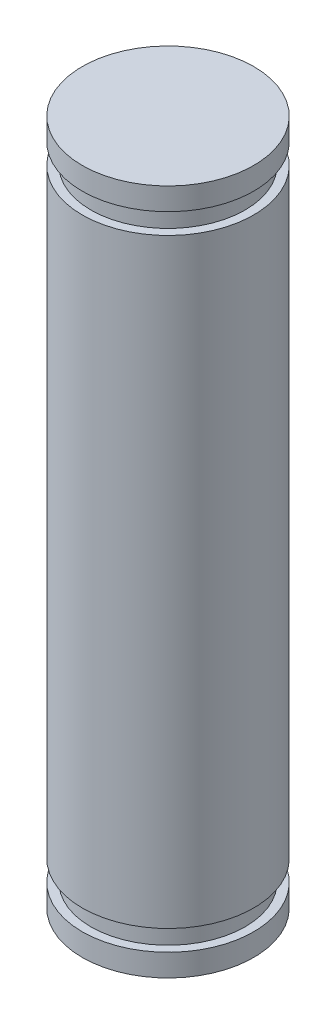
ISO-10303-21;
HEADER;
FILE_DESCRIPTION(('STEP AP214'),'2;1');
FILE_NAME('part.step','',(''),(''),'','','');
FILE_SCHEMA(('AUTOMOTIVE_DESIGN { 1 0 10303 214 1 1 1 1 }'));
ENDSEC;
DATA;
#1=APPLICATION_CONTEXT('core data for automotive mechanical design processes');
#2=APPLICATION_PROTOCOL_DEFINITION('international standard','automotive_design',2000,#1);
#3=PRODUCT_CONTEXT('',#1,'mechanical');
#4=PRODUCT('Part','Part','',(#3));
#5=PRODUCT_RELATED_PRODUCT_CATEGORY('part','',(#4));
#6=PRODUCT_DEFINITION_FORMATION('','',#4);
#7=PRODUCT_DEFINITION_CONTEXT('part definition',#1,'design');
#8=PRODUCT_DEFINITION('design','',#6,#7);
#9=PRODUCT_DEFINITION_SHAPE('','',#8);
#10=(LENGTH_UNIT() NAMED_UNIT(*) SI_UNIT(.MILLI.,.METRE.));
#11=(NAMED_UNIT(*) PLANE_ANGLE_UNIT() SI_UNIT($,.RADIAN.));
#12=(NAMED_UNIT(*) SI_UNIT($,.STERADIAN.) SOLID_ANGLE_UNIT());
#13=UNCERTAINTY_MEASURE_WITH_UNIT(LENGTH_MEASURE(1.E-05),#10,'distance_accuracy_value','');
#14=(GEOMETRIC_REPRESENTATION_CONTEXT(3) GLOBAL_UNCERTAINTY_ASSIGNED_CONTEXT((#13)) GLOBAL_UNIT_ASSIGNED_CONTEXT((#10,
#11,#12)) REPRESENTATION_CONTEXT('',''));
#15=CARTESIAN_POINT('',(0.,0.,0.));
#16=DIRECTION('',(0.,0.,1.));
#17=DIRECTION('',(1.,0.,0.));
#18=AXIS2_PLACEMENT_3D('',#15,#16,#17);
#19=CARTESIAN_POINT('',(-11.955644483101,36.1149363933196,0.));
#20=DIRECTION('',(0.,-1.,0.));
#21=DIRECTION('',(0.,0.,-1.));
#22=AXIS2_PLACEMENT_3D('',#19,#20,#21);
#23=CYLINDRICAL_SURFACE('',#22,5.);
#24=CARTESIAN_POINT('',(-11.955644483101,37.4149363933196,0.));
#25=DIRECTION('',(0.,-1.,0.));
#26=DIRECTION('',(0.,0.,-1.));
#27=AXIS2_PLACEMENT_3D('',#24,#25,#26);
#28=CIRCLE('',#27,5.);
#29=CARTESIAN_POINT('',(-11.955644483101,37.4149363933196,-5.));
#30=VERTEX_POINT('',#29);
#31=EDGE_CURVE('E10',#30,#30,#28,.T.);
#32=ORIENTED_EDGE('',*,*,#31,.T.);
#33=EDGE_LOOP('',(#32));
#34=FACE_BOUND('',#33,.T.);
#35=CARTESIAN_POINT('',(-11.955644483101,36.1149363933196,0.));
#36=DIRECTION('',(0.,-1.,0.));
#37=DIRECTION('',(0.,0.,-1.));
#38=AXIS2_PLACEMENT_3D('',#35,#36,#37);
#39=CIRCLE('',#38,5.);
#40=CARTESIAN_POINT('',(-11.955644483101,36.1149363933196,-5.));
#41=VERTEX_POINT('',#40);
#42=EDGE_CURVE('E80',#41,#41,#39,.T.);
#43=ORIENTED_EDGE('',*,*,#42,.F.);
#44=EDGE_LOOP('',(#43));
#45=FACE_BOUND('',#44,.T.);
#46=ADVANCED_FACE('F37',(#34,#45),#23,.T.);
#47=CARTESIAN_POINT('',(-6.95564448310102,37.4149363933196,0.));
#48=DIRECTION('',(0.,1.,0.));
#49=DIRECTION('',(0.,0.,1.));
#50=AXIS2_PLACEMENT_3D('',#47,#48,#49);
#51=PLANE('',#50);
#52=CARTESIAN_POINT('',(-11.955644483101,37.4149363933196,0.));
#53=DIRECTION('',(0.,-1.,0.));
#54=DIRECTION('',(0.,0.,-1.));
#55=AXIS2_PLACEMENT_3D('',#52,#53,#54);
#56=CIRCLE('',#55,4.5);
#57=CARTESIAN_POINT('',(-11.955644483101,37.4149363933196,-4.5));
#58=VERTEX_POINT('',#57);
#59=EDGE_CURVE('E44',#58,#58,#56,.T.);
#60=ORIENTED_EDGE('',*,*,#59,.T.);
#61=EDGE_LOOP('',(#60));
#62=FACE_BOUND('',#61,.T.);
#63=ORIENTED_EDGE('',*,*,#31,.F.);
#64=EDGE_LOOP('',(#63));
#65=FACE_BOUND('',#64,.T.);
#66=ADVANCED_FACE('F88',(#62,#65),#51,.T.);
#67=CARTESIAN_POINT('',(-11.955644483101,36.1149363933196,0.));
#68=DIRECTION('',(0.,-1.,0.));
#69=DIRECTION('',(0.,0.,-1.));
#70=AXIS2_PLACEMENT_3D('',#67,#68,#69);
#71=CYLINDRICAL_SURFACE('',#70,4.5);
#72=CARTESIAN_POINT('',(-11.955644483101,38.6149363933196,0.));
#73=DIRECTION('',(0.,-1.,0.));
#74=DIRECTION('',(0.,0.,-1.));
#75=AXIS2_PLACEMENT_3D('',#72,#73,#74);
#76=CIRCLE('',#75,4.5);
#77=CARTESIAN_POINT('',(-11.955644483101,38.6149363933196,-4.5));
#78=VERTEX_POINT('',#77);
#79=EDGE_CURVE('E49',#78,#78,#76,.T.);
#80=ORIENTED_EDGE('',*,*,#79,.T.);
#81=EDGE_LOOP('',(#80));
#82=FACE_BOUND('',#81,.T.);
#83=ORIENTED_EDGE('',*,*,#59,.F.);
#84=EDGE_LOOP('',(#83));
#85=FACE_BOUND('',#84,.T.);
#86=ADVANCED_FACE('F92',(#82,#85),#71,.T.);
#87=CARTESIAN_POINT('',(-7.45564448310102,38.6149363933196,0.));
#88=DIRECTION('',(0.,-1.,0.));
#89=DIRECTION('',(0.,0.,-1.));
#90=AXIS2_PLACEMENT_3D('',#87,#88,#89);
#91=PLANE('',#90);
#92=CARTESIAN_POINT('',(-11.955644483101,38.6149363933196,0.));
#93=DIRECTION('',(0.,-1.,0.));
#94=DIRECTION('',(0.,0.,-1.));
#95=AXIS2_PLACEMENT_3D('',#92,#93,#94);
#96=CIRCLE('',#95,5.);
#97=CARTESIAN_POINT('',(-11.955644483101,38.6149363933196,-5.));
#98=VERTEX_POINT('',#97);
#99=EDGE_CURVE('E54',#98,#98,#96,.T.);
#100=ORIENTED_EDGE('',*,*,#99,.T.);
#101=EDGE_LOOP('',(#100));
#102=FACE_BOUND('',#101,.T.);
#103=ORIENTED_EDGE('',*,*,#79,.F.);
#104=EDGE_LOOP('',(#103));
#105=FACE_BOUND('',#104,.T.);
#106=ADVANCED_FACE('F96',(#102,#105),#91,.T.);
#107=CARTESIAN_POINT('',(-11.955644483101,36.1149363933196,0.));
#108=DIRECTION('',(0.,-1.,0.));
#109=DIRECTION('',(0.,0.,-1.));
#110=AXIS2_PLACEMENT_3D('',#107,#108,#109);
#111=CYLINDRICAL_SURFACE('',#110,5.);
#112=CARTESIAN_POINT('',(-11.955644483101,73.6149363933196,0.));
#113=DIRECTION('',(0.,-1.,0.));
#114=DIRECTION('',(0.,0.,-1.));
#115=AXIS2_PLACEMENT_3D('',#112,#113,#114);
#116=CIRCLE('',#115,5.);
#117=CARTESIAN_POINT('',(-11.955644483101,73.6149363933196,-5.));
#118=VERTEX_POINT('',#117);
#119=EDGE_CURVE('E60',#118,#118,#116,.T.);
#120=ORIENTED_EDGE('',*,*,#119,.T.);
#121=EDGE_LOOP('',(#120));
#122=FACE_BOUND('',#121,.T.);
#123=ORIENTED_EDGE('',*,*,#99,.F.);
#124=EDGE_LOOP('',(#123));
#125=FACE_BOUND('',#124,.T.);
#126=ADVANCED_FACE('F103',(#122,#125),#111,.T.);
#127=CARTESIAN_POINT('',(-6.95564448310102,73.6149363933196,0.));
#128=DIRECTION('',(0.,1.,0.));
#129=DIRECTION('',(0.,0.,1.));
#130=AXIS2_PLACEMENT_3D('',#127,#128,#129);
#131=PLANE('',#130);
#132=CARTESIAN_POINT('',(-11.955644483101,73.6149363933196,0.));
#133=DIRECTION('',(0.,-1.,0.));
#134=DIRECTION('',(0.,0.,-1.));
#135=AXIS2_PLACEMENT_3D('',#132,#133,#134);
#136=CIRCLE('',#135,4.5);
#137=CARTESIAN_POINT('',(-11.955644483101,73.6149363933196,-4.5));
#138=VERTEX_POINT('',#137);
#139=EDGE_CURVE('E64',#138,#138,#136,.T.);
#140=ORIENTED_EDGE('',*,*,#139,.T.);
#141=EDGE_LOOP('',(#140));
#142=FACE_BOUND('',#141,.T.);
#143=ORIENTED_EDGE('',*,*,#119,.F.);
#144=EDGE_LOOP('',(#143));
#145=FACE_BOUND('',#144,.T.);
#146=ADVANCED_FACE('F107',(#142,#145),#131,.T.);
#147=CARTESIAN_POINT('',(-11.955644483101,36.1149363933196,0.));
#148=DIRECTION('',(0.,-1.,0.));
#149=DIRECTION('',(0.,0.,-1.));
#150=AXIS2_PLACEMENT_3D('',#147,#148,#149);
#151=CYLINDRICAL_SURFACE('',#150,4.5);
#152=CARTESIAN_POINT('',(-11.955644483101,74.8149363933196,0.));
#153=DIRECTION('',(0.,-1.,0.));
#154=DIRECTION('',(0.,0.,-1.));
#155=AXIS2_PLACEMENT_3D('',#152,#153,#154);
#156=CIRCLE('',#155,4.5);
#157=CARTESIAN_POINT('',(-11.955644483101,74.8149363933196,-4.5));
#158=VERTEX_POINT('',#157);
#159=EDGE_CURVE('E68',#158,#158,#156,.T.);
#160=ORIENTED_EDGE('',*,*,#159,.T.);
#161=EDGE_LOOP('',(#160));
#162=FACE_BOUND('',#161,.T.);
#163=ORIENTED_EDGE('',*,*,#139,.F.);
#164=EDGE_LOOP('',(#163));
#165=FACE_BOUND('',#164,.T.);
#166=ADVANCED_FACE('F111',(#162,#165),#151,.T.);
#167=CARTESIAN_POINT('',(-7.45564448310102,74.8149363933196,0.));
#168=DIRECTION('',(0.,-1.,0.));
#169=DIRECTION('',(0.,0.,-1.));
#170=AXIS2_PLACEMENT_3D('',#167,#168,#169);
#171=PLANE('',#170);
#172=CARTESIAN_POINT('',(-11.955644483101,74.8149363933196,0.));
#173=DIRECTION('',(0.,-1.,0.));
#174=DIRECTION('',(0.,0.,-1.));
#175=AXIS2_PLACEMENT_3D('',#172,#173,#174);
#176=CIRCLE('',#175,5.);
#177=CARTESIAN_POINT('',(-11.955644483101,74.8149363933196,-5.));
#178=VERTEX_POINT('',#177);
#179=EDGE_CURVE('E72',#178,#178,#176,.T.);
#180=ORIENTED_EDGE('',*,*,#179,.T.);
#181=EDGE_LOOP('',(#180));
#182=FACE_BOUND('',#181,.T.);
#183=ORIENTED_EDGE('',*,*,#159,.F.);
#184=EDGE_LOOP('',(#183));
#185=FACE_BOUND('',#184,.T.);
#186=ADVANCED_FACE('F115',(#182,#185),#171,.T.);
#187=CARTESIAN_POINT('',(-11.955644483101,36.1149363933196,0.));
#188=DIRECTION('',(0.,-1.,0.));
#189=DIRECTION('',(0.,0.,-1.));
#190=AXIS2_PLACEMENT_3D('',#187,#188,#189);
#191=CYLINDRICAL_SURFACE('',#190,5.);
#192=CARTESIAN_POINT('',(-11.955644483101,76.1149363933196,0.));
#193=DIRECTION('',(0.,-1.,0.));
#194=DIRECTION('',(0.,0.,-1.));
#195=AXIS2_PLACEMENT_3D('',#192,#193,#194);
#196=CIRCLE('',#195,5.);
#197=CARTESIAN_POINT('',(-11.955644483101,76.1149363933196,-5.));
#198=VERTEX_POINT('',#197);
#199=EDGE_CURVE('E76',#198,#198,#196,.T.);
#200=ORIENTED_EDGE('',*,*,#199,.T.);
#201=EDGE_LOOP('',(#200));
#202=FACE_BOUND('',#201,.T.);
#203=ORIENTED_EDGE('',*,*,#179,.F.);
#204=EDGE_LOOP('',(#203));
#205=FACE_BOUND('',#204,.T.);
#206=ADVANCED_FACE('F119',(#202,#205),#191,.T.);
#207=CARTESIAN_POINT('',(-6.95564448310102,76.1149363933196,0.));
#208=DIRECTION('',(0.,1.,0.));
#209=DIRECTION('',(0.,0.,1.));
#210=AXIS2_PLACEMENT_3D('',#207,#208,#209);
#211=PLANE('',#210);
#212=ORIENTED_EDGE('',*,*,#199,.F.);
#213=EDGE_LOOP('',(#212));
#214=FACE_BOUND('',#213,.T.);
#215=ADVANCED_FACE('F123',(#214),#211,.T.);
#216=CARTESIAN_POINT('',(-6.95564448310102,36.1149363933196,0.));
#217=DIRECTION('',(0.,-1.,0.));
#218=DIRECTION('',(0.,0.,-1.));
#219=AXIS2_PLACEMENT_3D('',#216,#217,#218);
#220=PLANE('',#219);
#221=ORIENTED_EDGE('',*,*,#42,.T.);
#222=EDGE_LOOP('',(#221));
#223=FACE_BOUND('',#222,.T.);
#224=ADVANCED_FACE('F85',(#223),#220,.T.);
#225=CLOSED_SHELL('',(#46,#66,#86,#106,#126,#146,#166,#186,#206,#215,#224));
#226=MANIFOLD_SOLID_BREP('B2',#225);
#227=ADVANCED_BREP_SHAPE_REPRESENTATION('',(#18,#226),#14);
#228=SHAPE_DEFINITION_REPRESENTATION(#9,#227);
ENDSEC;
END-ISO-10303-21;
